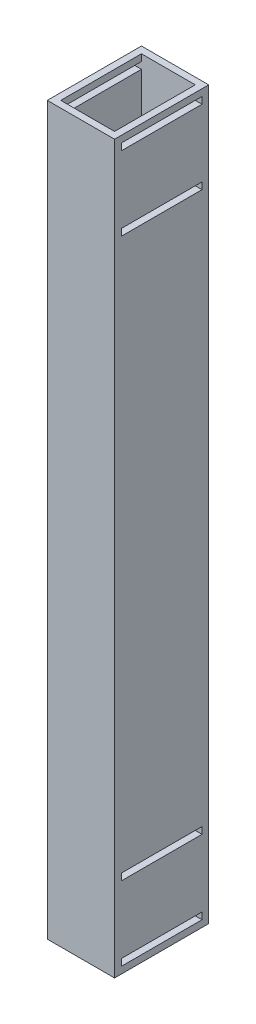
ISO-10303-21;
HEADER;
FILE_DESCRIPTION(('STEP AP214'),'2;1');
FILE_NAME('part.step','',(''),(''),'','','');
FILE_SCHEMA(('AUTOMOTIVE_DESIGN { 1 0 10303 214 1 1 1 1 }'));
ENDSEC;
DATA;
#1=APPLICATION_CONTEXT('core data for automotive mechanical design processes');
#2=APPLICATION_PROTOCOL_DEFINITION('international standard','automotive_design',2000,#1);
#3=PRODUCT_CONTEXT('',#1,'mechanical');
#4=PRODUCT('Part','Part','',(#3));
#5=PRODUCT_RELATED_PRODUCT_CATEGORY('part','',(#4));
#6=PRODUCT_DEFINITION_FORMATION('','',#4);
#7=PRODUCT_DEFINITION_CONTEXT('part definition',#1,'design');
#8=PRODUCT_DEFINITION('design','',#6,#7);
#9=PRODUCT_DEFINITION_SHAPE('','',#8);
#10=(LENGTH_UNIT() NAMED_UNIT(*) SI_UNIT(.MILLI.,.METRE.));
#11=(NAMED_UNIT(*) PLANE_ANGLE_UNIT() SI_UNIT($,.RADIAN.));
#12=(NAMED_UNIT(*) SI_UNIT($,.STERADIAN.) SOLID_ANGLE_UNIT());
#13=UNCERTAINTY_MEASURE_WITH_UNIT(LENGTH_MEASURE(1.E-05),#10,'distance_accuracy_value','');
#14=(GEOMETRIC_REPRESENTATION_CONTEXT(3) GLOBAL_UNCERTAINTY_ASSIGNED_CONTEXT((#13)) GLOBAL_UNIT_ASSIGNED_CONTEXT((#10,
#11,#12)) REPRESENTATION_CONTEXT('',''));
#15=CARTESIAN_POINT('',(0.,0.,0.));
#16=DIRECTION('',(0.,0.,1.));
#17=DIRECTION('',(1.,0.,0.));
#18=AXIS2_PLACEMENT_3D('',#15,#16,#17);
#19=CARTESIAN_POINT('',(-20.,270.,35.));
#20=DIRECTION('',(1.,0.,0.));
#21=DIRECTION('',(0.,0.,-1.));
#22=AXIS2_PLACEMENT_3D('',#19,#20,#21);
#23=PLANE('',#22);
#24=DIRECTION('',(0.,0.,-1.));
#25=VECTOR('',#24,1.);
#26=CARTESIAN_POINT('',(-20.,-265.,35.));
#27=LINE('',#26,#25);
#28=CARTESIAN_POINT('',(-20.,-265.,30.));
#29=VERTEX_POINT('',#28);
#30=CARTESIAN_POINT('',(-20.,-265.,-30.));
#31=VERTEX_POINT('',#30);
#32=EDGE_CURVE('E463',#29,#31,#27,.T.);
#33=ORIENTED_EDGE('',*,*,#32,.F.);
#34=DIRECTION('',(0.,-1.,0.));
#35=VECTOR('',#34,1.);
#36=CARTESIAN_POINT('',(-20.,270.,30.));
#37=LINE('',#36,#35);
#38=CARTESIAN_POINT('',(-20.,-270.,30.));
#39=VERTEX_POINT('',#38);
#40=EDGE_CURVE('E499',#29,#39,#37,.T.);
#41=ORIENTED_EDGE('',*,*,#40,.T.);
#42=DIRECTION('',(0.,0.,1.));
#43=VECTOR('',#42,1.);
#44=CARTESIAN_POINT('',(-20.,-270.,35.));
#45=LINE('',#44,#43);
#46=CARTESIAN_POINT('',(-20.,-270.,-30.));
#47=VERTEX_POINT('',#46);
#48=EDGE_CURVE('E493',#47,#39,#45,.T.);
#49=ORIENTED_EDGE('',*,*,#48,.F.);
#50=DIRECTION('',(0.,-1.,0.));
#51=VECTOR('',#50,1.);
#52=CARTESIAN_POINT('',(-20.,270.,-30.));
#53=LINE('',#52,#51);
#54=EDGE_CURVE('E504',#31,#47,#53,.T.);
#55=ORIENTED_EDGE('',*,*,#54,.F.);
#56=EDGE_LOOP('',(#33,#41,#49,#55));
#57=FACE_BOUND('',#56,.T.);
#58=ADVANCED_FACE('F47',(#57),#23,.T.);
#59=DIRECTION('',(0.,0.,1.));
#60=VECTOR('',#59,1.);
#61=CARTESIAN_POINT('',(-20.,265.,35.));
#62=LINE('',#61,#60);
#63=CARTESIAN_POINT('',(-20.,265.,-30.));
#64=VERTEX_POINT('',#63);
#65=CARTESIAN_POINT('',(-20.,265.,30.));
#66=VERTEX_POINT('',#65);
#67=EDGE_CURVE('E448',#64,#66,#62,.T.);
#68=ORIENTED_EDGE('',*,*,#67,.F.);
#69=CARTESIAN_POINT('',(-20.,270.,-30.));
#70=VERTEX_POINT('',#69);
#71=EDGE_CURVE('E500',#70,#64,#53,.T.);
#72=ORIENTED_EDGE('',*,*,#71,.F.);
#73=DIRECTION('',(0.,0.,1.));
#74=VECTOR('',#73,1.);
#75=CARTESIAN_POINT('',(-20.,270.,35.));
#76=LINE('',#75,#74);
#77=CARTESIAN_POINT('',(-20.,270.,30.));
#78=VERTEX_POINT('',#77);
#79=EDGE_CURVE('E520',#70,#78,#76,.T.);
#80=ORIENTED_EDGE('',*,*,#79,.T.);
#81=EDGE_CURVE('E494',#78,#66,#37,.T.);
#82=ORIENTED_EDGE('',*,*,#81,.T.);
#83=EDGE_LOOP('',(#68,#72,#80,#82));
#84=FACE_BOUND('',#83,.T.);
#85=ADVANCED_FACE('F587',(#84),#23,.T.);
#86=DIRECTION('',(0.,0.,-1.));
#87=VECTOR('',#86,1.);
#88=CARTESIAN_POINT('',(-20.,260.,35.));
#89=LINE('',#88,#87);
#90=CARTESIAN_POINT('',(-20.,260.,30.));
#91=VERTEX_POINT('',#90);
#92=CARTESIAN_POINT('',(-20.,260.,-30.));
#93=VERTEX_POINT('',#92);
#94=EDGE_CURVE('E441',#91,#93,#89,.T.);
#95=ORIENTED_EDGE('',*,*,#94,.F.);
#96=CARTESIAN_POINT('',(-20.,210.,30.));
#97=VERTEX_POINT('',#96);
#98=EDGE_CURVE('E498',#91,#97,#37,.T.);
#99=ORIENTED_EDGE('',*,*,#98,.T.);
#100=DIRECTION('',(0.,0.,1.));
#101=VECTOR('',#100,1.);
#102=CARTESIAN_POINT('',(-20.,210.,35.));
#103=LINE('',#102,#101);
#104=CARTESIAN_POINT('',(-20.,210.,-30.));
#105=VERTEX_POINT('',#104);
#106=EDGE_CURVE('E434',#105,#97,#103,.T.);
#107=ORIENTED_EDGE('',*,*,#106,.F.);
#108=EDGE_CURVE('E313',#93,#105,#53,.T.);
#109=ORIENTED_EDGE('',*,*,#108,.F.);
#110=EDGE_LOOP('',(#95,#99,#107,#109));
#111=FACE_BOUND('',#110,.T.);
#112=ADVANCED_FACE('F594',(#111),#23,.T.);
#113=DIRECTION('',(0.,0.,1.));
#114=VECTOR('',#113,1.);
#115=CARTESIAN_POINT('',(-20.,-260.,35.));
#116=LINE('',#115,#114);
#117=CARTESIAN_POINT('',(-20.,-260.,-30.));
#118=VERTEX_POINT('',#117);
#119=CARTESIAN_POINT('',(-20.,-260.,30.));
#120=VERTEX_POINT('',#119);
#121=EDGE_CURVE('E456',#118,#120,#116,.T.);
#122=ORIENTED_EDGE('',*,*,#121,.F.);
#123=CARTESIAN_POINT('',(-20.,-210.,-30.));
#124=VERTEX_POINT('',#123);
#125=EDGE_CURVE('E630',#124,#118,#53,.T.);
#126=ORIENTED_EDGE('',*,*,#125,.F.);
#127=DIRECTION('',(0.,0.,-1.));
#128=VECTOR('',#127,1.);
#129=CARTESIAN_POINT('',(-20.,-210.,35.));
#130=LINE('',#129,#128);
#131=CARTESIAN_POINT('',(-20.,-210.,30.));
#132=VERTEX_POINT('',#131);
#133=EDGE_CURVE('E419',#132,#124,#130,.T.);
#134=ORIENTED_EDGE('',*,*,#133,.F.);
#135=EDGE_CURVE('E632',#132,#120,#37,.T.);
#136=ORIENTED_EDGE('',*,*,#135,.T.);
#137=EDGE_LOOP('',(#122,#126,#134,#136));
#138=FACE_BOUND('',#137,.T.);
#139=ADVANCED_FACE('F602',(#138),#23,.T.);
#140=CARTESIAN_POINT('',(20.,270.,35.));
#141=DIRECTION('',(-1.,0.,0.));
#142=DIRECTION('',(0.,0.,1.));
#143=AXIS2_PLACEMENT_3D('',#140,#141,#142);
#144=PLANE('',#143);
#145=DIRECTION('',(0.,0.,1.));
#146=VECTOR('',#145,1.);
#147=CARTESIAN_POINT('',(20.,-265.,35.));
#148=LINE('',#147,#146);
#149=CARTESIAN_POINT('',(20.,-265.,-30.));
#150=VERTEX_POINT('',#149);
#151=CARTESIAN_POINT('',(20.,-265.,30.));
#152=VERTEX_POINT('',#151);
#153=EDGE_CURVE('E461',#150,#152,#148,.T.);
#154=ORIENTED_EDGE('',*,*,#153,.F.);
#155=DIRECTION('',(0.,-1.,0.));
#156=VECTOR('',#155,1.);
#157=CARTESIAN_POINT('',(20.,270.,-30.));
#158=LINE('',#157,#156);
#159=CARTESIAN_POINT('',(20.,-270.,-30.));
#160=VERTEX_POINT('',#159);
#161=EDGE_CURVE('E503',#150,#160,#158,.T.);
#162=ORIENTED_EDGE('',*,*,#161,.T.);
#163=DIRECTION('',(0.,0.,-1.));
#164=VECTOR('',#163,1.);
#165=CARTESIAN_POINT('',(20.,-270.,35.));
#166=LINE('',#165,#164);
#167=CARTESIAN_POINT('',(20.,-270.,30.));
#168=VERTEX_POINT('',#167);
#169=EDGE_CURVE('E521',#168,#160,#166,.T.);
#170=ORIENTED_EDGE('',*,*,#169,.F.);
#171=DIRECTION('',(0.,-1.,0.));
#172=VECTOR('',#171,1.);
#173=CARTESIAN_POINT('',(20.,270.,30.));
#174=LINE('',#173,#172);
#175=EDGE_CURVE('E509',#152,#168,#174,.T.);
#176=ORIENTED_EDGE('',*,*,#175,.F.);
#177=EDGE_LOOP('',(#154,#162,#170,#176));
#178=FACE_BOUND('',#177,.T.);
#179=ADVANCED_FACE('F614',(#178),#144,.T.);
#180=DIRECTION('',(0.,0.,-1.));
#181=VECTOR('',#180,1.);
#182=CARTESIAN_POINT('',(20.,265.,35.));
#183=LINE('',#182,#181);
#184=CARTESIAN_POINT('',(20.,265.,30.));
#185=VERTEX_POINT('',#184);
#186=CARTESIAN_POINT('',(20.,265.,-30.));
#187=VERTEX_POINT('',#186);
#188=EDGE_CURVE('E446',#185,#187,#183,.T.);
#189=ORIENTED_EDGE('',*,*,#188,.F.);
#190=CARTESIAN_POINT('',(20.,270.,30.));
#191=VERTEX_POINT('',#190);
#192=EDGE_CURVE('E505',#191,#185,#174,.T.);
#193=ORIENTED_EDGE('',*,*,#192,.F.);
#194=DIRECTION('',(0.,0.,-1.));
#195=VECTOR('',#194,1.);
#196=CARTESIAN_POINT('',(20.,270.,35.));
#197=LINE('',#196,#195);
#198=CARTESIAN_POINT('',(20.,270.,-30.));
#199=VERTEX_POINT('',#198);
#200=EDGE_CURVE('E529',#191,#199,#197,.T.);
#201=ORIENTED_EDGE('',*,*,#200,.T.);
#202=EDGE_CURVE('E510',#199,#187,#158,.T.);
#203=ORIENTED_EDGE('',*,*,#202,.T.);
#204=EDGE_LOOP('',(#189,#193,#201,#203));
#205=FACE_BOUND('',#204,.T.);
#206=ADVANCED_FACE('F621',(#205),#144,.T.);
#207=DIRECTION('',(0.,0.,1.));
#208=VECTOR('',#207,1.);
#209=CARTESIAN_POINT('',(20.,260.,35.));
#210=LINE('',#209,#208);
#211=CARTESIAN_POINT('',(20.,260.,-30.));
#212=VERTEX_POINT('',#211);
#213=CARTESIAN_POINT('',(20.,260.,30.));
#214=VERTEX_POINT('',#213);
#215=EDGE_CURVE('E439',#212,#214,#210,.T.);
#216=ORIENTED_EDGE('',*,*,#215,.F.);
#217=CARTESIAN_POINT('',(20.,210.,-30.));
#218=VERTEX_POINT('',#217);
#219=EDGE_CURVE('E513',#212,#218,#158,.T.);
#220=ORIENTED_EDGE('',*,*,#219,.T.);
#221=DIRECTION('',(0.,0.,-1.));
#222=VECTOR('',#221,1.);
#223=CARTESIAN_POINT('',(20.,210.,35.));
#224=LINE('',#223,#222);
#225=CARTESIAN_POINT('',(20.,210.,30.));
#226=VERTEX_POINT('',#225);
#227=EDGE_CURVE('E432',#226,#218,#224,.T.);
#228=ORIENTED_EDGE('',*,*,#227,.F.);
#229=EDGE_CURVE('E508',#214,#226,#174,.T.);
#230=ORIENTED_EDGE('',*,*,#229,.F.);
#231=EDGE_LOOP('',(#216,#220,#228,#230));
#232=FACE_BOUND('',#231,.T.);
#233=ADVANCED_FACE('F662',(#232),#144,.T.);
#234=DIRECTION('',(0.,0.,-1.));
#235=VECTOR('',#234,1.);
#236=CARTESIAN_POINT('',(20.,-260.,35.));
#237=LINE('',#236,#235);
#238=CARTESIAN_POINT('',(20.,-260.,30.));
#239=VERTEX_POINT('',#238);
#240=CARTESIAN_POINT('',(20.,-260.,-30.));
#241=VERTEX_POINT('',#240);
#242=EDGE_CURVE('E453',#239,#241,#237,.T.);
#243=ORIENTED_EDGE('',*,*,#242,.F.);
#244=CARTESIAN_POINT('',(20.,-210.,30.));
#245=VERTEX_POINT('',#244);
#246=EDGE_CURVE('E688',#245,#239,#174,.T.);
#247=ORIENTED_EDGE('',*,*,#246,.F.);
#248=DIRECTION('',(0.,0.,1.));
#249=VECTOR('',#248,1.);
#250=CARTESIAN_POINT('',(20.,-210.,35.));
#251=LINE('',#250,#249);
#252=CARTESIAN_POINT('',(20.,-210.,-30.));
#253=VERTEX_POINT('',#252);
#254=EDGE_CURVE('E417',#253,#245,#251,.T.);
#255=ORIENTED_EDGE('',*,*,#254,.F.);
#256=EDGE_CURVE('E646',#253,#241,#158,.T.);
#257=ORIENTED_EDGE('',*,*,#256,.T.);
#258=EDGE_LOOP('',(#243,#247,#255,#257));
#259=FACE_BOUND('',#258,.T.);
#260=ADVANCED_FACE('F584',(#259),#144,.T.);
#261=CARTESIAN_POINT('',(-25.,270.,35.));
#262=DIRECTION('',(1.,0.,0.));
#263=DIRECTION('',(0.,0.,-1.));
#264=AXIS2_PLACEMENT_3D('',#261,#262,#263);
#265=PLANE('',#264);
#266=DIRECTION('',(0.,-1.,0.));
#267=VECTOR('',#266,1.);
#268=CARTESIAN_POINT('',(-25.,-265.,30.));
#269=LINE('',#268,#267);
#270=CARTESIAN_POINT('',(-25.,-260.,30.));
#271=VERTEX_POINT('',#270);
#272=CARTESIAN_POINT('',(-25.,-265.,30.));
#273=VERTEX_POINT('',#272);
#274=EDGE_CURVE('E341',#271,#273,#269,.T.);
#275=ORIENTED_EDGE('',*,*,#274,.T.);
#276=DIRECTION('',(0.,0.,-1.));
#277=VECTOR('',#276,1.);
#278=CARTESIAN_POINT('',(-25.,-265.,30.));
#279=LINE('',#278,#277);
#280=CARTESIAN_POINT('',(-25.,-265.,-30.));
#281=VERTEX_POINT('',#280);
#282=EDGE_CURVE('E359',#273,#281,#279,.T.);
#283=ORIENTED_EDGE('',*,*,#282,.T.);
#284=DIRECTION('',(0.,1.,0.));
#285=VECTOR('',#284,1.);
#286=CARTESIAN_POINT('',(-25.,-265.,-30.));
#287=LINE('',#286,#285);
#288=CARTESIAN_POINT('',(-25.,-260.,-30.));
#289=VERTEX_POINT('',#288);
#290=EDGE_CURVE('E356',#281,#289,#287,.T.);
#291=ORIENTED_EDGE('',*,*,#290,.T.);
#292=DIRECTION('',(0.,0.,1.));
#293=VECTOR('',#292,1.);
#294=CARTESIAN_POINT('',(-25.,-260.,30.));
#295=LINE('',#294,#293);
#296=EDGE_CURVE('E62',#289,#271,#295,.T.);
#297=ORIENTED_EDGE('',*,*,#296,.T.);
#298=EDGE_LOOP('',(#275,#283,#291,#297));
#299=FACE_BOUND('',#298,.T.);
#300=DIRECTION('',(0.,0.,1.));
#301=VECTOR('',#300,1.);
#302=CARTESIAN_POINT('',(-25.,265.,30.));
#303=LINE('',#302,#301);
#304=CARTESIAN_POINT('',(-25.,265.,-30.));
#305=VERTEX_POINT('',#304);
#306=CARTESIAN_POINT('',(-25.,265.,30.));
#307=VERTEX_POINT('',#306);
#308=EDGE_CURVE('E365',#305,#307,#303,.T.);
#309=ORIENTED_EDGE('',*,*,#308,.T.);
#310=DIRECTION('',(0.,-1.,0.));
#311=VECTOR('',#310,1.);
#312=CARTESIAN_POINT('',(-25.,265.,30.));
#313=LINE('',#312,#311);
#314=CARTESIAN_POINT('',(-25.,260.,30.));
#315=VERTEX_POINT('',#314);
#316=EDGE_CURVE('E382',#307,#315,#313,.T.);
#317=ORIENTED_EDGE('',*,*,#316,.T.);
#318=DIRECTION('',(0.,0.,-1.));
#319=VECTOR('',#318,1.);
#320=CARTESIAN_POINT('',(-25.,260.,30.));
#321=LINE('',#320,#319);
#322=CARTESIAN_POINT('',(-25.,260.,-30.));
#323=VERTEX_POINT('',#322);
#324=EDGE_CURVE('E379',#315,#323,#321,.T.);
#325=ORIENTED_EDGE('',*,*,#324,.T.);
#326=DIRECTION('',(0.,1.,0.));
#327=VECTOR('',#326,1.);
#328=CARTESIAN_POINT('',(-25.,265.,-30.));
#329=LINE('',#328,#327);
#330=EDGE_CURVE('E70',#323,#305,#329,.T.);
#331=ORIENTED_EDGE('',*,*,#330,.T.);
#332=EDGE_LOOP('',(#309,#317,#325,#331));
#333=FACE_BOUND('',#332,.T.);
#334=DIRECTION('',(0.,1.,0.));
#335=VECTOR('',#334,1.);
#336=CARTESIAN_POINT('',(-25.,210.,-30.));
#337=LINE('',#336,#335);
#338=CARTESIAN_POINT('',(-25.,205.,-30.));
#339=VERTEX_POINT('',#338);
#340=CARTESIAN_POINT('',(-25.,210.,-30.));
#341=VERTEX_POINT('',#340);
#342=EDGE_CURVE('E310',#339,#341,#337,.T.);
#343=ORIENTED_EDGE('',*,*,#342,.T.);
#344=DIRECTION('',(0.,0.,1.));
#345=VECTOR('',#344,1.);
#346=CARTESIAN_POINT('',(-25.,210.,30.));
#347=LINE('',#346,#345);
#348=CARTESIAN_POINT('',(-25.,210.,30.));
#349=VERTEX_POINT('',#348);
#350=EDGE_CURVE('E321',#341,#349,#347,.T.);
#351=ORIENTED_EDGE('',*,*,#350,.T.);
#352=DIRECTION('',(0.,-1.,0.));
#353=VECTOR('',#352,1.);
#354=CARTESIAN_POINT('',(-25.,210.,30.));
#355=LINE('',#354,#353);
#356=CARTESIAN_POINT('',(-25.,205.,30.));
#357=VERTEX_POINT('',#356);
#358=EDGE_CURVE('E328',#349,#357,#355,.T.);
#359=ORIENTED_EDGE('',*,*,#358,.T.);
#360=DIRECTION('',(0.,0.,-1.));
#361=VECTOR('',#360,1.);
#362=CARTESIAN_POINT('',(-25.,205.,30.));
#363=LINE('',#362,#361);
#364=EDGE_CURVE('E331',#357,#339,#363,.T.);
#365=ORIENTED_EDGE('',*,*,#364,.T.);
#366=EDGE_LOOP('',(#343,#351,#359,#365));
#367=FACE_BOUND('',#366,.T.);
#368=DIRECTION('',(0.,0.,-1.));
#369=VECTOR('',#368,1.);
#370=CARTESIAN_POINT('',(-25.,-210.,30.));
#371=LINE('',#370,#369);
#372=CARTESIAN_POINT('',(-25.,-210.,30.));
#373=VERTEX_POINT('',#372);
#374=CARTESIAN_POINT('',(-25.,-210.,-30.));
#375=VERTEX_POINT('',#374);
#376=EDGE_CURVE('E393',#373,#375,#371,.T.);
#377=ORIENTED_EDGE('',*,*,#376,.T.);
#378=DIRECTION('',(0.,1.,0.));
#379=VECTOR('',#378,1.);
#380=CARTESIAN_POINT('',(-25.,-210.,-30.));
#381=LINE('',#380,#379);
#382=CARTESIAN_POINT('',(-25.,-205.,-30.));
#383=VERTEX_POINT('',#382);
#384=EDGE_CURVE('E362',#375,#383,#381,.T.);
#385=ORIENTED_EDGE('',*,*,#384,.T.);
#386=DIRECTION('',(0.,0.,1.));
#387=VECTOR('',#386,1.);
#388=CARTESIAN_POINT('',(-25.,-205.,30.));
#389=LINE('',#388,#387);
#390=CARTESIAN_POINT('',(-25.,-205.,30.));
#391=VERTEX_POINT('',#390);
#392=EDGE_CURVE('E387',#383,#391,#389,.T.);
#393=ORIENTED_EDGE('',*,*,#392,.T.);
#394=DIRECTION('',(0.,-1.,0.));
#395=VECTOR('',#394,1.);
#396=CARTESIAN_POINT('',(-25.,-210.,30.));
#397=LINE('',#396,#395);
#398=EDGE_CURVE('E390',#391,#373,#397,.T.);
#399=ORIENTED_EDGE('',*,*,#398,.T.);
#400=EDGE_LOOP('',(#377,#385,#393,#399));
#401=FACE_BOUND('',#400,.T.);
#402=DIRECTION('',(0.,0.,1.));
#403=VECTOR('',#402,1.);
#404=CARTESIAN_POINT('',(-25.,-270.,35.));
#405=LINE('',#404,#403);
#406=CARTESIAN_POINT('',(-25.,-270.,-35.));
#407=VERTEX_POINT('',#406);
#408=CARTESIAN_POINT('',(-25.,-270.,35.));
#409=VERTEX_POINT('',#408);
#410=EDGE_CURVE('E497',#407,#409,#405,.T.);
#411=ORIENTED_EDGE('',*,*,#410,.T.);
#412=DIRECTION('',(0.,-1.,0.));
#413=VECTOR('',#412,1.);
#414=CARTESIAN_POINT('',(-25.,270.,35.));
#415=LINE('',#414,#413);
#416=CARTESIAN_POINT('',(-25.,270.,35.));
#417=VERTEX_POINT('',#416);
#418=EDGE_CURVE('E11',#417,#409,#415,.T.);
#419=ORIENTED_EDGE('',*,*,#418,.F.);
#420=DIRECTION('',(0.,0.,1.));
#421=VECTOR('',#420,1.);
#422=CARTESIAN_POINT('',(-25.,270.,35.));
#423=LINE('',#422,#421);
#424=CARTESIAN_POINT('',(-25.,270.,-35.));
#425=VERTEX_POINT('',#424);
#426=EDGE_CURVE('E534',#425,#417,#423,.T.);
#427=ORIENTED_EDGE('',*,*,#426,.F.);
#428=DIRECTION('',(0.,-1.,0.));
#429=VECTOR('',#428,1.);
#430=CARTESIAN_POINT('',(-25.,270.,-35.));
#431=LINE('',#430,#429);
#432=EDGE_CURVE('E544',#425,#407,#431,.T.);
#433=ORIENTED_EDGE('',*,*,#432,.T.);
#434=EDGE_LOOP('',(#411,#419,#427,#433));
#435=FACE_BOUND('',#434,.T.);
#436=ADVANCED_FACE('F49',(#299,#333,#367,#401,#435),#265,.F.);
#437=CARTESIAN_POINT('',(25.,270.,35.));
#438=DIRECTION('',(0.,0.,-1.));
#439=DIRECTION('',(-1.,0.,0.));
#440=AXIS2_PLACEMENT_3D('',#437,#438,#439);
#441=PLANE('',#440);
#442=DIRECTION('',(1.,0.,0.));
#443=VECTOR('',#442,1.);
#444=CARTESIAN_POINT('',(25.,-270.,35.));
#445=LINE('',#444,#443);
#446=CARTESIAN_POINT('',(25.,-270.,35.));
#447=VERTEX_POINT('',#446);
#448=EDGE_CURVE('E547',#409,#447,#445,.T.);
#449=ORIENTED_EDGE('',*,*,#448,.T.);
#450=DIRECTION('',(0.,-1.,0.));
#451=VECTOR('',#450,1.);
#452=CARTESIAN_POINT('',(25.,270.,35.));
#453=LINE('',#452,#451);
#454=CARTESIAN_POINT('',(25.,270.,35.));
#455=VERTEX_POINT('',#454);
#456=EDGE_CURVE('E55',#455,#447,#453,.T.);
#457=ORIENTED_EDGE('',*,*,#456,.F.);
#458=DIRECTION('',(1.,0.,0.));
#459=VECTOR('',#458,1.);
#460=CARTESIAN_POINT('',(25.,270.,35.));
#461=LINE('',#460,#459);
#462=EDGE_CURVE('E537',#417,#455,#461,.T.);
#463=ORIENTED_EDGE('',*,*,#462,.F.);
#464=ORIENTED_EDGE('',*,*,#418,.T.);
#465=EDGE_LOOP('',(#449,#457,#463,#464));
#466=FACE_BOUND('',#465,.T.);
#467=ADVANCED_FACE('F577',(#466),#441,.F.);
#468=CARTESIAN_POINT('',(25.,270.,35.));
#469=DIRECTION('',(-1.,0.,0.));
#470=DIRECTION('',(0.,0.,1.));
#471=AXIS2_PLACEMENT_3D('',#468,#469,#470);
#472=PLANE('',#471);
#473=DIRECTION('',(0.,-1.,0.));
#474=VECTOR('',#473,1.);
#475=CARTESIAN_POINT('',(25.,270.,-30.0000000000004));
#476=LINE('',#475,#474);
#477=CARTESIAN_POINT('',(25.,-260.,-30.));
#478=VERTEX_POINT('',#477);
#479=CARTESIAN_POINT('',(25.,-265.,-30.));
#480=VERTEX_POINT('',#479);
#481=EDGE_CURVE('E487',#478,#480,#476,.T.);
#482=ORIENTED_EDGE('',*,*,#481,.T.);
#483=DIRECTION('',(0.,0.,1.));
#484=VECTOR('',#483,1.);
#485=CARTESIAN_POINT('',(25.,-265.,35.));
#486=LINE('',#485,#484);
#487=CARTESIAN_POINT('',(25.,-265.,30.));
#488=VERTEX_POINT('',#487);
#489=EDGE_CURVE('E466',#480,#488,#486,.T.);
#490=ORIENTED_EDGE('',*,*,#489,.T.);
#491=DIRECTION('',(0.,1.,0.));
#492=VECTOR('',#491,1.);
#493=CARTESIAN_POINT('',(25.,270.,30.));
#494=LINE('',#493,#492);
#495=CARTESIAN_POINT('',(25.,-260.,30.));
#496=VERTEX_POINT('',#495);
#497=EDGE_CURVE('E490',#488,#496,#494,.T.);
#498=ORIENTED_EDGE('',*,*,#497,.T.);
#499=DIRECTION('',(0.,0.,-1.));
#500=VECTOR('',#499,1.);
#501=CARTESIAN_POINT('',(25.,-260.,35.));
#502=LINE('',#501,#500);
#503=EDGE_CURVE('E458',#496,#478,#502,.T.);
#504=ORIENTED_EDGE('',*,*,#503,.T.);
#505=EDGE_LOOP('',(#482,#490,#498,#504));
#506=FACE_BOUND('',#505,.T.);
#507=DIRECTION('',(0.,0.,1.));
#508=VECTOR('',#507,1.);
#509=CARTESIAN_POINT('',(25.,260.,35.));
#510=LINE('',#509,#508);
#511=CARTESIAN_POINT('',(25.,260.,-30.));
#512=VERTEX_POINT('',#511);
#513=CARTESIAN_POINT('',(25.,260.,30.));
#514=VERTEX_POINT('',#513);
#515=EDGE_CURVE('E443',#512,#514,#510,.T.);
#516=ORIENTED_EDGE('',*,*,#515,.T.);
#517=DIRECTION('',(0.,1.,0.));
#518=VECTOR('',#517,1.);
#519=CARTESIAN_POINT('',(25.,270.,30.));
#520=LINE('',#519,#518);
#521=CARTESIAN_POINT('',(25.,265.,30.));
#522=VERTEX_POINT('',#521);
#523=EDGE_CURVE('E484',#514,#522,#520,.T.);
#524=ORIENTED_EDGE('',*,*,#523,.T.);
#525=DIRECTION('',(0.,0.,-1.));
#526=VECTOR('',#525,1.);
#527=CARTESIAN_POINT('',(25.,265.,35.));
#528=LINE('',#527,#526);
#529=CARTESIAN_POINT('',(25.,265.,-30.));
#530=VERTEX_POINT('',#529);
#531=EDGE_CURVE('E450',#522,#530,#528,.T.);
#532=ORIENTED_EDGE('',*,*,#531,.T.);
#533=DIRECTION('',(0.,-1.,0.));
#534=VECTOR('',#533,1.);
#535=CARTESIAN_POINT('',(25.,270.,-30.));
#536=LINE('',#535,#534);
#537=EDGE_CURVE('E481',#530,#512,#536,.T.);
#538=ORIENTED_EDGE('',*,*,#537,.T.);
#539=EDGE_LOOP('',(#516,#524,#532,#538));
#540=FACE_BOUND('',#539,.T.);
#541=DIRECTION('',(0.,1.,0.));
#542=VECTOR('',#541,1.);
#543=CARTESIAN_POINT('',(25.,270.,30.));
#544=LINE('',#543,#542);
#545=CARTESIAN_POINT('',(25.,205.,30.));
#546=VERTEX_POINT('',#545);
#547=CARTESIAN_POINT('',(25.,210.,30.));
#548=VERTEX_POINT('',#547);
#549=EDGE_CURVE('E475',#546,#548,#544,.T.);
#550=ORIENTED_EDGE('',*,*,#549,.T.);
#551=DIRECTION('',(0.,0.,-1.));
#552=VECTOR('',#551,1.);
#553=CARTESIAN_POINT('',(25.,210.,35.));
#554=LINE('',#553,#552);
#555=CARTESIAN_POINT('',(25.,210.,-30.));
#556=VERTEX_POINT('',#555);
#557=EDGE_CURVE('E436',#548,#556,#554,.T.);
#558=ORIENTED_EDGE('',*,*,#557,.T.);
#559=DIRECTION('',(0.,-1.,0.));
#560=VECTOR('',#559,1.);
#561=CARTESIAN_POINT('',(25.,270.,-30.));
#562=LINE('',#561,#560);
#563=CARTESIAN_POINT('',(25.,205.,-30.));
#564=VERTEX_POINT('',#563);
#565=EDGE_CURVE('E478',#556,#564,#562,.T.);
#566=ORIENTED_EDGE('',*,*,#565,.T.);
#567=DIRECTION('',(0.,0.,1.));
#568=VECTOR('',#567,1.);
#569=CARTESIAN_POINT('',(25.,205.,35.));
#570=LINE('',#569,#568);
#571=EDGE_CURVE('E429',#564,#546,#570,.T.);
#572=ORIENTED_EDGE('',*,*,#571,.T.);
#573=EDGE_LOOP('',(#550,#558,#566,#572));
#574=FACE_BOUND('',#573,.T.);
#575=DIRECTION('',(0.,0.,-1.));
#576=VECTOR('',#575,1.);
#577=CARTESIAN_POINT('',(25.,-205.,35.));
#578=LINE('',#577,#576);
#579=CARTESIAN_POINT('',(25.,-205.,30.));
#580=VERTEX_POINT('',#579);
#581=CARTESIAN_POINT('',(25.,-205.,-30.));
#582=VERTEX_POINT('',#581);
#583=EDGE_CURVE('E414',#580,#582,#578,.T.);
#584=ORIENTED_EDGE('',*,*,#583,.T.);
#585=DIRECTION('',(0.,-1.,0.));
#586=VECTOR('',#585,1.);
#587=CARTESIAN_POINT('',(25.,270.,-30.));
#588=LINE('',#587,#586);
#589=CARTESIAN_POINT('',(25.,-210.,-30.));
#590=VERTEX_POINT('',#589);
#591=EDGE_CURVE('E472',#582,#590,#588,.T.);
#592=ORIENTED_EDGE('',*,*,#591,.T.);
#593=DIRECTION('',(0.,0.,1.));
#594=VECTOR('',#593,1.);
#595=CARTESIAN_POINT('',(25.,-210.,35.));
#596=LINE('',#595,#594);
#597=CARTESIAN_POINT('',(25.,-210.,30.));
#598=VERTEX_POINT('',#597);
#599=EDGE_CURVE('E421',#590,#598,#596,.T.);
#600=ORIENTED_EDGE('',*,*,#599,.T.);
#601=DIRECTION('',(0.,1.,0.));
#602=VECTOR('',#601,1.);
#603=CARTESIAN_POINT('',(25.,270.,30.));
#604=LINE('',#603,#602);
#605=EDGE_CURVE('E469',#598,#580,#604,.T.);
#606=ORIENTED_EDGE('',*,*,#605,.T.);
#607=EDGE_LOOP('',(#584,#592,#600,#606));
#608=FACE_BOUND('',#607,.T.);
#609=DIRECTION('',(0.,0.,-1.));
#610=VECTOR('',#609,1.);
#611=CARTESIAN_POINT('',(25.,-270.,35.));
#612=LINE('',#611,#610);
#613=CARTESIAN_POINT('',(25.,-270.,-35.));
#614=VERTEX_POINT('',#613);
#615=EDGE_CURVE('E549',#447,#614,#612,.T.);
#616=ORIENTED_EDGE('',*,*,#615,.T.);
#617=DIRECTION('',(0.,-1.,0.));
#618=VECTOR('',#617,1.);
#619=CARTESIAN_POINT('',(25.,270.,-35.));
#620=LINE('',#619,#618);
#621=CARTESIAN_POINT('',(25.,270.,-35.));
#622=VERTEX_POINT('',#621);
#623=EDGE_CURVE('E554',#622,#614,#620,.T.);
#624=ORIENTED_EDGE('',*,*,#623,.F.);
#625=DIRECTION('',(0.,0.,-1.));
#626=VECTOR('',#625,1.);
#627=CARTESIAN_POINT('',(25.,270.,35.));
#628=LINE('',#627,#626);
#629=EDGE_CURVE('E540',#455,#622,#628,.T.);
#630=ORIENTED_EDGE('',*,*,#629,.F.);
#631=ORIENTED_EDGE('',*,*,#456,.T.);
#632=EDGE_LOOP('',(#616,#624,#630,#631));
#633=FACE_BOUND('',#632,.T.);
#634=ADVANCED_FACE('F561',(#506,#540,#574,#608,#633),#472,.F.);
#635=CARTESIAN_POINT('',(25.,270.,-35.));
#636=DIRECTION('',(0.,0.,1.));
#637=DIRECTION('',(1.,0.,0.));
#638=AXIS2_PLACEMENT_3D('',#635,#636,#637);
#639=PLANE('',#638);
#640=DIRECTION('',(-1.,0.,0.));
#641=VECTOR('',#640,1.);
#642=CARTESIAN_POINT('',(25.,-270.,-35.));
#643=LINE('',#642,#641);
#644=EDGE_CURVE('E538',#614,#407,#643,.T.);
#645=ORIENTED_EDGE('',*,*,#644,.T.);
#646=ORIENTED_EDGE('',*,*,#432,.F.);
#647=DIRECTION('',(-1.,0.,0.));
#648=VECTOR('',#647,1.);
#649=CARTESIAN_POINT('',(25.,270.,-35.));
#650=LINE('',#649,#648);
#651=EDGE_CURVE('E542',#622,#425,#650,.T.);
#652=ORIENTED_EDGE('',*,*,#651,.F.);
#653=ORIENTED_EDGE('',*,*,#623,.T.);
#654=EDGE_LOOP('',(#645,#646,#652,#653));
#655=FACE_BOUND('',#654,.T.);
#656=ADVANCED_FACE('F570',(#655),#639,.F.);
#657=CARTESIAN_POINT('',(0.,270.,0.));
#658=DIRECTION('',(0.,1.,0.));
#659=DIRECTION('',(0.,0.,1.));
#660=AXIS2_PLACEMENT_3D('',#657,#658,#659);
#661=PLANE('',#660);
#662=ORIENTED_EDGE('',*,*,#79,.F.);
#663=DIRECTION('',(-1.,0.,0.));
#664=VECTOR('',#663,1.);
#665=CARTESIAN_POINT('',(25.,270.,-30.));
#666=LINE('',#665,#664);
#667=EDGE_CURVE('E532',#199,#70,#666,.T.);
#668=ORIENTED_EDGE('',*,*,#667,.F.);
#669=ORIENTED_EDGE('',*,*,#200,.F.);
#670=DIRECTION('',(1.,0.,0.));
#671=VECTOR('',#670,1.);
#672=CARTESIAN_POINT('',(25.,270.,30.));
#673=LINE('',#672,#671);
#674=EDGE_CURVE('E527',#78,#191,#673,.T.);
#675=ORIENTED_EDGE('',*,*,#674,.F.);
#676=EDGE_LOOP('',(#662,#668,#669,#675));
#677=FACE_BOUND('',#676,.T.);
#678=ORIENTED_EDGE('',*,*,#426,.T.);
#679=ORIENTED_EDGE('',*,*,#462,.T.);
#680=ORIENTED_EDGE('',*,*,#629,.T.);
#681=ORIENTED_EDGE('',*,*,#651,.T.);
#682=EDGE_LOOP('',(#678,#679,#680,#681));
#683=FACE_BOUND('',#682,.T.);
#684=ADVANCED_FACE('F576',(#677,#683),#661,.T.);
#685=CARTESIAN_POINT('',(0.,-270.,0.));
#686=DIRECTION('',(0.,1.,0.));
#687=DIRECTION('',(0.,0.,1.));
#688=AXIS2_PLACEMENT_3D('',#685,#686,#687);
#689=PLANE('',#688);
#690=DIRECTION('',(-1.,0.,0.));
#691=VECTOR('',#690,1.);
#692=CARTESIAN_POINT('',(25.,-270.,-30.));
#693=LINE('',#692,#691);
#694=EDGE_CURVE('E517',#160,#47,#693,.T.);
#695=ORIENTED_EDGE('',*,*,#694,.T.);
#696=ORIENTED_EDGE('',*,*,#48,.T.);
#697=DIRECTION('',(1.,0.,0.));
#698=VECTOR('',#697,1.);
#699=CARTESIAN_POINT('',(25.,-270.,30.));
#700=LINE('',#699,#698);
#701=EDGE_CURVE('E516',#39,#168,#700,.T.);
#702=ORIENTED_EDGE('',*,*,#701,.T.);
#703=ORIENTED_EDGE('',*,*,#169,.T.);
#704=EDGE_LOOP('',(#695,#696,#702,#703));
#705=FACE_BOUND('',#704,.T.);
#706=ORIENTED_EDGE('',*,*,#410,.F.);
#707=ORIENTED_EDGE('',*,*,#644,.F.);
#708=ORIENTED_EDGE('',*,*,#615,.F.);
#709=ORIENTED_EDGE('',*,*,#448,.F.);
#710=EDGE_LOOP('',(#706,#707,#708,#709));
#711=FACE_BOUND('',#710,.T.);
#712=ADVANCED_FACE('F567',(#705,#711),#689,.F.);
#713=DIRECTION('',(0.,0.,-1.));
#714=VECTOR('',#713,1.);
#715=CARTESIAN_POINT('',(-20.,205.,35.));
#716=LINE('',#715,#714);
#717=CARTESIAN_POINT('',(-20.,205.,30.));
#718=VERTEX_POINT('',#717);
#719=CARTESIAN_POINT('',(-20.,205.,-30.));
#720=VERTEX_POINT('',#719);
#721=EDGE_CURVE('E427',#718,#720,#716,.T.);
#722=ORIENTED_EDGE('',*,*,#721,.F.);
#723=CARTESIAN_POINT('',(-20.,-205.,30.));
#724=VERTEX_POINT('',#723);
#725=EDGE_CURVE('E730',#718,#724,#37,.T.);
#726=ORIENTED_EDGE('',*,*,#725,.T.);
#727=DIRECTION('',(0.,0.,1.));
#728=VECTOR('',#727,1.);
#729=CARTESIAN_POINT('',(-20.,-205.,35.));
#730=LINE('',#729,#728);
#731=CARTESIAN_POINT('',(-20.,-205.,-30.));
#732=VERTEX_POINT('',#731);
#733=EDGE_CURVE('E412',#732,#724,#730,.T.);
#734=ORIENTED_EDGE('',*,*,#733,.F.);
#735=EDGE_CURVE('E635',#720,#732,#53,.T.);
#736=ORIENTED_EDGE('',*,*,#735,.F.);
#737=EDGE_LOOP('',(#722,#726,#734,#736));
#738=FACE_BOUND('',#737,.T.);
#739=ADVANCED_FACE('F590',(#738),#23,.T.);
#740=CARTESIAN_POINT('',(25.,270.,30.));
#741=DIRECTION('',(0.,0.,-1.));
#742=DIRECTION('',(-1.,0.,0.));
#743=AXIS2_PLACEMENT_3D('',#740,#741,#742);
#744=PLANE('',#743);
#745=ORIENTED_EDGE('',*,*,#725,.F.);
#746=DIRECTION('',(1.,0.,0.));
#747=VECTOR('',#746,1.);
#748=CARTESIAN_POINT('',(-25.,205.,30.));
#749=LINE('',#748,#747);
#750=EDGE_CURVE('E681',#357,#718,#749,.T.);
#751=ORIENTED_EDGE('',*,*,#750,.F.);
#752=ORIENTED_EDGE('',*,*,#358,.F.);
#753=DIRECTION('',(1.,0.,0.));
#754=VECTOR('',#753,1.);
#755=CARTESIAN_POINT('',(-25.,210.,30.));
#756=LINE('',#755,#754);
#757=EDGE_CURVE('E323',#349,#97,#756,.T.);
#758=ORIENTED_EDGE('',*,*,#757,.T.);
#759=ORIENTED_EDGE('',*,*,#98,.F.);
#760=DIRECTION('',(1.,0.,0.));
#761=VECTOR('',#760,1.);
#762=CARTESIAN_POINT('',(-25.,260.,30.));
#763=LINE('',#762,#761);
#764=EDGE_CURVE('E363',#315,#91,#763,.T.);
#765=ORIENTED_EDGE('',*,*,#764,.F.);
#766=ORIENTED_EDGE('',*,*,#316,.F.);
#767=DIRECTION('',(1.,0.,0.));
#768=VECTOR('',#767,1.);
#769=CARTESIAN_POINT('',(-25.,265.,30.));
#770=LINE('',#769,#768);
#771=EDGE_CURVE('E373',#307,#66,#770,.T.);
#772=ORIENTED_EDGE('',*,*,#771,.T.);
#773=ORIENTED_EDGE('',*,*,#81,.F.);
#774=ORIENTED_EDGE('',*,*,#674,.T.);
#775=ORIENTED_EDGE('',*,*,#192,.T.);
#776=EDGE_CURVE('E327',#185,#522,#770,.T.);
#777=ORIENTED_EDGE('',*,*,#776,.T.);
#778=ORIENTED_EDGE('',*,*,#523,.F.);
#779=EDGE_CURVE('E366',#214,#514,#763,.T.);
#780=ORIENTED_EDGE('',*,*,#779,.F.);
#781=ORIENTED_EDGE('',*,*,#229,.T.);
#782=EDGE_CURVE('E334',#226,#548,#756,.T.);
#783=ORIENTED_EDGE('',*,*,#782,.T.);
#784=ORIENTED_EDGE('',*,*,#549,.F.);
#785=CARTESIAN_POINT('',(20.,205.,30.));
#786=VERTEX_POINT('',#785);
#787=EDGE_CURVE('E677',#786,#546,#749,.T.);
#788=ORIENTED_EDGE('',*,*,#787,.F.);
#789=CARTESIAN_POINT('',(20.,-205.,30.));
#790=VERTEX_POINT('',#789);
#791=EDGE_CURVE('E686',#786,#790,#174,.T.);
#792=ORIENTED_EDGE('',*,*,#791,.T.);
#793=DIRECTION('',(1.,0.,0.));
#794=VECTOR('',#793,1.);
#795=CARTESIAN_POINT('',(-25.,-205.,30.));
#796=LINE('',#795,#794);
#797=EDGE_CURVE('E408',#790,#580,#796,.T.);
#798=ORIENTED_EDGE('',*,*,#797,.T.);
#799=ORIENTED_EDGE('',*,*,#605,.F.);
#800=DIRECTION('',(1.,0.,0.));
#801=VECTOR('',#800,1.);
#802=CARTESIAN_POINT('',(-25.,-210.,30.));
#803=LINE('',#802,#801);
#804=EDGE_CURVE('E404',#245,#598,#803,.T.);
#805=ORIENTED_EDGE('',*,*,#804,.F.);
#806=ORIENTED_EDGE('',*,*,#246,.T.);
#807=DIRECTION('',(1.,0.,0.));
#808=VECTOR('',#807,1.);
#809=CARTESIAN_POINT('',(-25.,-260.,30.));
#810=LINE('',#809,#808);
#811=EDGE_CURVE('E349',#239,#496,#810,.T.);
#812=ORIENTED_EDGE('',*,*,#811,.T.);
#813=ORIENTED_EDGE('',*,*,#497,.F.);
#814=DIRECTION('',(1.,0.,0.));
#815=VECTOR('',#814,1.);
#816=CARTESIAN_POINT('',(-25.,-265.,30.));
#817=LINE('',#816,#815);
#818=EDGE_CURVE('E352',#152,#488,#817,.T.);
#819=ORIENTED_EDGE('',*,*,#818,.F.);
#820=ORIENTED_EDGE('',*,*,#175,.T.);
#821=ORIENTED_EDGE('',*,*,#701,.F.);
#822=ORIENTED_EDGE('',*,*,#40,.F.);
#823=EDGE_CURVE('E350',#273,#29,#817,.T.);
#824=ORIENTED_EDGE('',*,*,#823,.F.);
#825=ORIENTED_EDGE('',*,*,#274,.F.);
#826=EDGE_CURVE('E346',#271,#120,#810,.T.);
#827=ORIENTED_EDGE('',*,*,#826,.T.);
#828=ORIENTED_EDGE('',*,*,#135,.F.);
#829=EDGE_CURVE('E402',#373,#132,#803,.T.);
#830=ORIENTED_EDGE('',*,*,#829,.F.);
#831=ORIENTED_EDGE('',*,*,#398,.F.);
#832=EDGE_CURVE('E405',#391,#724,#796,.T.);
#833=ORIENTED_EDGE('',*,*,#832,.T.);
#834=EDGE_LOOP('',(#745,#751,#752,#758,#759,#765,#766,#772,#773,#774,#775,#777,#778,#780,#781,
#783,#784,#788,#792,#798,#799,#805,#806,#812,#813,#819,#820,#821,#822,#824,#825,#827,#828,#830,
#831,#833));
#835=FACE_BOUND('',#834,.T.);
#836=ADVANCED_FACE('F600',(#835),#744,.T.);
#837=DIRECTION('',(0.,0.,1.));
#838=VECTOR('',#837,1.);
#839=CARTESIAN_POINT('',(20.,205.,35.));
#840=LINE('',#839,#838);
#841=CARTESIAN_POINT('',(20.,205.,-30.));
#842=VERTEX_POINT('',#841);
#843=EDGE_CURVE('E424',#842,#786,#840,.T.);
#844=ORIENTED_EDGE('',*,*,#843,.F.);
#845=CARTESIAN_POINT('',(20.,-205.,-30.));
#846=VERTEX_POINT('',#845);
#847=EDGE_CURVE('E648',#842,#846,#158,.T.);
#848=ORIENTED_EDGE('',*,*,#847,.T.);
#849=DIRECTION('',(0.,0.,-1.));
#850=VECTOR('',#849,1.);
#851=CARTESIAN_POINT('',(20.,-205.,35.));
#852=LINE('',#851,#850);
#853=EDGE_CURVE('E400',#790,#846,#852,.T.);
#854=ORIENTED_EDGE('',*,*,#853,.F.);
#855=ORIENTED_EDGE('',*,*,#791,.F.);
#856=EDGE_LOOP('',(#844,#848,#854,#855));
#857=FACE_BOUND('',#856,.T.);
#858=ADVANCED_FACE('F607',(#857),#144,.T.);
#859=CARTESIAN_POINT('',(25.,270.,-30.));
#860=DIRECTION('',(0.,0.,1.));
#861=DIRECTION('',(1.,0.,0.));
#862=AXIS2_PLACEMENT_3D('',#859,#860,#861);
#863=PLANE('',#862);
#864=ORIENTED_EDGE('',*,*,#847,.F.);
#865=DIRECTION('',(1.,0.,0.));
#866=VECTOR('',#865,1.);
#867=CARTESIAN_POINT('',(-25.,205.,-30.));
#868=LINE('',#867,#866);
#869=EDGE_CURVE('E317',#842,#564,#868,.T.);
#870=ORIENTED_EDGE('',*,*,#869,.T.);
#871=ORIENTED_EDGE('',*,*,#565,.F.);
#872=DIRECTION('',(1.,0.,0.));
#873=VECTOR('',#872,1.);
#874=CARTESIAN_POINT('',(-25.,210.,-30.));
#875=LINE('',#874,#873);
#876=EDGE_CURVE('E318',#218,#556,#875,.T.);
#877=ORIENTED_EDGE('',*,*,#876,.F.);
#878=ORIENTED_EDGE('',*,*,#219,.F.);
#879=DIRECTION('',(1.,0.,0.));
#880=VECTOR('',#879,1.);
#881=CARTESIAN_POINT('',(-25.,260.,-30.));
#882=LINE('',#881,#880);
#883=EDGE_CURVE('E369',#212,#512,#882,.T.);
#884=ORIENTED_EDGE('',*,*,#883,.T.);
#885=ORIENTED_EDGE('',*,*,#537,.F.);
#886=DIRECTION('',(1.,0.,0.));
#887=VECTOR('',#886,1.);
#888=CARTESIAN_POINT('',(-25.,265.,-30.));
#889=LINE('',#888,#887);
#890=EDGE_CURVE('E372',#187,#530,#889,.T.);
#891=ORIENTED_EDGE('',*,*,#890,.F.);
#892=ORIENTED_EDGE('',*,*,#202,.F.);
#893=ORIENTED_EDGE('',*,*,#667,.T.);
#894=ORIENTED_EDGE('',*,*,#71,.T.);
#895=EDGE_CURVE('E370',#305,#64,#889,.T.);
#896=ORIENTED_EDGE('',*,*,#895,.F.);
#897=ORIENTED_EDGE('',*,*,#330,.F.);
#898=EDGE_CURVE('E367',#323,#93,#882,.T.);
#899=ORIENTED_EDGE('',*,*,#898,.T.);
#900=ORIENTED_EDGE('',*,*,#108,.T.);
#901=EDGE_CURVE('E304',#341,#105,#875,.T.);
#902=ORIENTED_EDGE('',*,*,#901,.F.);
#903=ORIENTED_EDGE('',*,*,#342,.F.);
#904=EDGE_CURVE('E682',#339,#720,#868,.T.);
#905=ORIENTED_EDGE('',*,*,#904,.T.);
#906=ORIENTED_EDGE('',*,*,#735,.T.);
#907=DIRECTION('',(1.,0.,0.));
#908=VECTOR('',#907,1.);
#909=CARTESIAN_POINT('',(-25.,-205.,-30.));
#910=LINE('',#909,#908);
#911=EDGE_CURVE('E409',#383,#732,#910,.T.);
#912=ORIENTED_EDGE('',*,*,#911,.F.);
#913=ORIENTED_EDGE('',*,*,#384,.F.);
#914=DIRECTION('',(1.,0.,0.));
#915=VECTOR('',#914,1.);
#916=CARTESIAN_POINT('',(-25.,-210.,-30.));
#917=LINE('',#916,#915);
#918=EDGE_CURVE('E397',#375,#124,#917,.T.);
#919=ORIENTED_EDGE('',*,*,#918,.T.);
#920=ORIENTED_EDGE('',*,*,#125,.T.);
#921=DIRECTION('',(1.,0.,0.));
#922=VECTOR('',#921,1.);
#923=CARTESIAN_POINT('',(-25.,-260.,-30.));
#924=LINE('',#923,#922);
#925=EDGE_CURVE('E343',#289,#118,#924,.T.);
#926=ORIENTED_EDGE('',*,*,#925,.F.);
#927=ORIENTED_EDGE('',*,*,#290,.F.);
#928=DIRECTION('',(1.,0.,0.));
#929=VECTOR('',#928,1.);
#930=CARTESIAN_POINT('',(-25.,-265.,-30.));
#931=LINE('',#930,#929);
#932=EDGE_CURVE('E339',#281,#31,#931,.T.);
#933=ORIENTED_EDGE('',*,*,#932,.T.);
#934=ORIENTED_EDGE('',*,*,#54,.T.);
#935=ORIENTED_EDGE('',*,*,#694,.F.);
#936=ORIENTED_EDGE('',*,*,#161,.F.);
#937=EDGE_CURVE('E342',#150,#480,#931,.T.);
#938=ORIENTED_EDGE('',*,*,#937,.T.);
#939=ORIENTED_EDGE('',*,*,#481,.F.);
#940=EDGE_CURVE('E345',#241,#478,#924,.T.);
#941=ORIENTED_EDGE('',*,*,#940,.F.);
#942=ORIENTED_EDGE('',*,*,#256,.F.);
#943=EDGE_CURVE('E401',#253,#590,#917,.T.);
#944=ORIENTED_EDGE('',*,*,#943,.T.);
#945=ORIENTED_EDGE('',*,*,#591,.F.);
#946=EDGE_CURVE('E396',#846,#582,#910,.T.);
#947=ORIENTED_EDGE('',*,*,#946,.F.);
#948=EDGE_LOOP('',(#864,#870,#871,#877,#878,#884,#885,#891,#892,#893,#894,#896,#897,#899,#900,
#902,#903,#905,#906,#912,#913,#919,#920,#926,#927,#933,#934,#935,#936,#938,#939,#941,#942,#944,
#945,#947));
#949=FACE_BOUND('',#948,.T.);
#950=ADVANCED_FACE('F307',(#949),#863,.T.);
#951=CARTESIAN_POINT('',(-25.,-205.,30.));
#952=DIRECTION('',(0.,1.,0.));
#953=DIRECTION('',(0.,0.,1.));
#954=AXIS2_PLACEMENT_3D('',#951,#952,#953);
#955=PLANE('',#954);
#956=ORIENTED_EDGE('',*,*,#797,.F.);
#957=ORIENTED_EDGE('',*,*,#853,.T.);
#958=ORIENTED_EDGE('',*,*,#946,.T.);
#959=ORIENTED_EDGE('',*,*,#583,.F.);
#960=EDGE_LOOP('',(#956,#957,#958,#959));
#961=FACE_BOUND('',#960,.T.);
#962=ADVANCED_FACE('F707',(#961),#955,.F.);
#963=CARTESIAN_POINT('',(-25.,-210.,30.));
#964=DIRECTION('',(0.,-1.,0.));
#965=DIRECTION('',(0.,0.,-1.));
#966=AXIS2_PLACEMENT_3D('',#963,#964,#965);
#967=PLANE('',#966);
#968=ORIENTED_EDGE('',*,*,#943,.F.);
#969=ORIENTED_EDGE('',*,*,#254,.T.);
#970=ORIENTED_EDGE('',*,*,#804,.T.);
#971=ORIENTED_EDGE('',*,*,#599,.F.);
#972=EDGE_LOOP('',(#968,#969,#970,#971));
#973=FACE_BOUND('',#972,.T.);
#974=ADVANCED_FACE('F708',(#973),#967,.F.);
#975=CARTESIAN_POINT('',(-25.,205.,30.));
#976=DIRECTION('',(0.,-1.,0.));
#977=DIRECTION('',(0.,0.,-1.));
#978=AXIS2_PLACEMENT_3D('',#975,#976,#977);
#979=PLANE('',#978);
#980=ORIENTED_EDGE('',*,*,#869,.F.);
#981=ORIENTED_EDGE('',*,*,#843,.T.);
#982=ORIENTED_EDGE('',*,*,#787,.T.);
#983=ORIENTED_EDGE('',*,*,#571,.F.);
#984=EDGE_LOOP('',(#980,#981,#982,#983));
#985=FACE_BOUND('',#984,.T.);
#986=ADVANCED_FACE('F679',(#985),#979,.F.);
#987=CARTESIAN_POINT('',(-25.,210.,30.));
#988=DIRECTION('',(0.,1.,0.));
#989=DIRECTION('',(0.,0.,1.));
#990=AXIS2_PLACEMENT_3D('',#987,#988,#989);
#991=PLANE('',#990);
#992=ORIENTED_EDGE('',*,*,#782,.F.);
#993=ORIENTED_EDGE('',*,*,#227,.T.);
#994=ORIENTED_EDGE('',*,*,#876,.T.);
#995=ORIENTED_EDGE('',*,*,#557,.F.);
#996=EDGE_LOOP('',(#992,#993,#994,#995));
#997=FACE_BOUND('',#996,.T.);
#998=ADVANCED_FACE('F671',(#997),#991,.F.);
#999=CARTESIAN_POINT('',(-25.,260.,30.));
#1000=DIRECTION('',(0.,-1.,0.));
#1001=DIRECTION('',(0.,0.,-1.));
#1002=AXIS2_PLACEMENT_3D('',#999,#1000,#1001);
#1003=PLANE('',#1002);
#1004=ORIENTED_EDGE('',*,*,#883,.F.);
#1005=ORIENTED_EDGE('',*,*,#215,.T.);
#1006=ORIENTED_EDGE('',*,*,#779,.T.);
#1007=ORIENTED_EDGE('',*,*,#515,.F.);
#1008=EDGE_LOOP('',(#1004,#1005,#1006,#1007));
#1009=FACE_BOUND('',#1008,.T.);
#1010=ADVANCED_FACE('F755',(#1009),#1003,.F.);
#1011=CARTESIAN_POINT('',(-25.,265.,30.));
#1012=DIRECTION('',(0.,1.,0.));
#1013=DIRECTION('',(0.,0.,1.));
#1014=AXIS2_PLACEMENT_3D('',#1011,#1012,#1013);
#1015=PLANE('',#1014);
#1016=ORIENTED_EDGE('',*,*,#776,.F.);
#1017=ORIENTED_EDGE('',*,*,#188,.T.);
#1018=ORIENTED_EDGE('',*,*,#890,.T.);
#1019=ORIENTED_EDGE('',*,*,#531,.F.);
#1020=EDGE_LOOP('',(#1016,#1017,#1018,#1019));
#1021=FACE_BOUND('',#1020,.T.);
#1022=ADVANCED_FACE('F749',(#1021),#1015,.F.);
#1023=CARTESIAN_POINT('',(-25.,-260.,30.));
#1024=DIRECTION('',(0.,1.,0.));
#1025=DIRECTION('',(0.,0.,1.));
#1026=AXIS2_PLACEMENT_3D('',#1023,#1024,#1025);
#1027=PLANE('',#1026);
#1028=ORIENTED_EDGE('',*,*,#811,.F.);
#1029=ORIENTED_EDGE('',*,*,#242,.T.);
#1030=ORIENTED_EDGE('',*,*,#940,.T.);
#1031=ORIENTED_EDGE('',*,*,#503,.F.);
#1032=EDGE_LOOP('',(#1028,#1029,#1030,#1031));
#1033=FACE_BOUND('',#1032,.T.);
#1034=ADVANCED_FACE('F701',(#1033),#1027,.F.);
#1035=CARTESIAN_POINT('',(-25.,-265.,30.));
#1036=DIRECTION('',(0.,-1.,0.));
#1037=DIRECTION('',(0.,0.,-1.));
#1038=AXIS2_PLACEMENT_3D('',#1035,#1036,#1037);
#1039=PLANE('',#1038);
#1040=ORIENTED_EDGE('',*,*,#937,.F.);
#1041=ORIENTED_EDGE('',*,*,#153,.T.);
#1042=ORIENTED_EDGE('',*,*,#818,.T.);
#1043=ORIENTED_EDGE('',*,*,#489,.F.);
#1044=EDGE_LOOP('',(#1040,#1041,#1042,#1043));
#1045=FACE_BOUND('',#1044,.T.);
#1046=ADVANCED_FACE('F697',(#1045),#1039,.F.);
#1047=ORIENTED_EDGE('',*,*,#133,.T.);
#1048=ORIENTED_EDGE('',*,*,#918,.F.);
#1049=ORIENTED_EDGE('',*,*,#376,.F.);
#1050=ORIENTED_EDGE('',*,*,#829,.T.);
#1051=EDGE_LOOP('',(#1047,#1048,#1049,#1050));
#1052=FACE_BOUND('',#1051,.T.);
#1053=ADVANCED_FACE('F711',(#1052),#967,.F.);
#1054=ORIENTED_EDGE('',*,*,#733,.T.);
#1055=ORIENTED_EDGE('',*,*,#832,.F.);
#1056=ORIENTED_EDGE('',*,*,#392,.F.);
#1057=ORIENTED_EDGE('',*,*,#911,.T.);
#1058=EDGE_LOOP('',(#1054,#1055,#1056,#1057));
#1059=FACE_BOUND('',#1058,.T.);
#1060=ADVANCED_FACE('F718',(#1059),#955,.F.);
#1061=ORIENTED_EDGE('',*,*,#106,.T.);
#1062=ORIENTED_EDGE('',*,*,#757,.F.);
#1063=ORIENTED_EDGE('',*,*,#350,.F.);
#1064=ORIENTED_EDGE('',*,*,#901,.T.);
#1065=EDGE_LOOP('',(#1061,#1062,#1063,#1064));
#1066=FACE_BOUND('',#1065,.T.);
#1067=ADVANCED_FACE('F322',(#1066),#991,.F.);
#1068=ORIENTED_EDGE('',*,*,#721,.T.);
#1069=ORIENTED_EDGE('',*,*,#904,.F.);
#1070=ORIENTED_EDGE('',*,*,#364,.F.);
#1071=ORIENTED_EDGE('',*,*,#750,.T.);
#1072=EDGE_LOOP('',(#1068,#1069,#1070,#1071));
#1073=FACE_BOUND('',#1072,.T.);
#1074=ADVANCED_FACE('F717',(#1073),#979,.F.);
#1075=ORIENTED_EDGE('',*,*,#67,.T.);
#1076=ORIENTED_EDGE('',*,*,#771,.F.);
#1077=ORIENTED_EDGE('',*,*,#308,.F.);
#1078=ORIENTED_EDGE('',*,*,#895,.T.);
#1079=EDGE_LOOP('',(#1075,#1076,#1077,#1078));
#1080=FACE_BOUND('',#1079,.T.);
#1081=ADVANCED_FACE('F743',(#1080),#1015,.F.);
#1082=ORIENTED_EDGE('',*,*,#94,.T.);
#1083=ORIENTED_EDGE('',*,*,#898,.F.);
#1084=ORIENTED_EDGE('',*,*,#324,.F.);
#1085=ORIENTED_EDGE('',*,*,#764,.T.);
#1086=EDGE_LOOP('',(#1082,#1083,#1084,#1085));
#1087=FACE_BOUND('',#1086,.T.);
#1088=ADVANCED_FACE('F747',(#1087),#1003,.F.);
#1089=ORIENTED_EDGE('',*,*,#32,.T.);
#1090=ORIENTED_EDGE('',*,*,#932,.F.);
#1091=ORIENTED_EDGE('',*,*,#282,.F.);
#1092=ORIENTED_EDGE('',*,*,#823,.T.);
#1093=EDGE_LOOP('',(#1089,#1090,#1091,#1092));
#1094=FACE_BOUND('',#1093,.T.);
#1095=ADVANCED_FACE('F727',(#1094),#1039,.F.);
#1096=ORIENTED_EDGE('',*,*,#121,.T.);
#1097=ORIENTED_EDGE('',*,*,#826,.F.);
#1098=ORIENTED_EDGE('',*,*,#296,.F.);
#1099=ORIENTED_EDGE('',*,*,#925,.T.);
#1100=EDGE_LOOP('',(#1096,#1097,#1098,#1099));
#1101=FACE_BOUND('',#1100,.T.);
#1102=ADVANCED_FACE('F754',(#1101),#1027,.F.);
#1103=CLOSED_SHELL('',(#58,#85,#112,#139,#179,#206,#233,#260,#436,#467,#634,#656,#684,#712,#739,
#836,#858,#950,#962,#974,#986,#998,#1010,#1022,#1034,#1046,#1053,#1060,#1067,#1074,#1081,#1088,
#1095,#1102));
#1104=MANIFOLD_SOLID_BREP('B2',#1103);
#1105=ADVANCED_BREP_SHAPE_REPRESENTATION('',(#18,#1104),#14);
#1106=SHAPE_DEFINITION_REPRESENTATION(#9,#1105);
ENDSEC;
END-ISO-10303-21;
